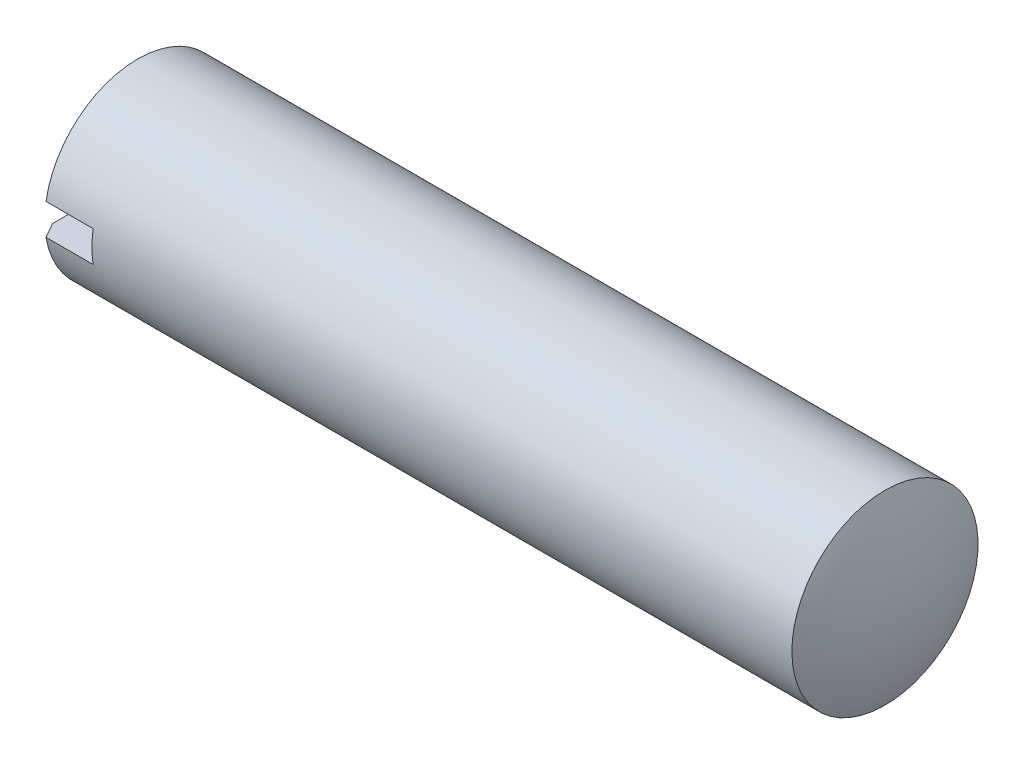
ISO-10303-21;
HEADER;
FILE_DESCRIPTION(('STEP AP214'),'2;1');
FILE_NAME('part.step','',(''),(''),'','','');
FILE_SCHEMA(('AUTOMOTIVE_DESIGN { 1 0 10303 214 1 1 1 1 }'));
ENDSEC;
DATA;
#1=APPLICATION_CONTEXT('core data for automotive mechanical design processes');
#2=APPLICATION_PROTOCOL_DEFINITION('international standard','automotive_design',2000,#1);
#3=PRODUCT_CONTEXT('',#1,'mechanical');
#4=PRODUCT('Part','Part','',(#3));
#5=PRODUCT_RELATED_PRODUCT_CATEGORY('part','',(#4));
#6=PRODUCT_DEFINITION_FORMATION('','',#4);
#7=PRODUCT_DEFINITION_CONTEXT('part definition',#1,'design');
#8=PRODUCT_DEFINITION('design','',#6,#7);
#9=PRODUCT_DEFINITION_SHAPE('','',#8);
#10=(LENGTH_UNIT() NAMED_UNIT(*) SI_UNIT(.MILLI.,.METRE.));
#11=(NAMED_UNIT(*) PLANE_ANGLE_UNIT() SI_UNIT($,.RADIAN.));
#12=(NAMED_UNIT(*) SI_UNIT($,.STERADIAN.) SOLID_ANGLE_UNIT());
#13=UNCERTAINTY_MEASURE_WITH_UNIT(LENGTH_MEASURE(1.E-05),#10,'distance_accuracy_value','');
#14=(GEOMETRIC_REPRESENTATION_CONTEXT(3) GLOBAL_UNCERTAINTY_ASSIGNED_CONTEXT((#13)) GLOBAL_UNIT_ASSIGNED_CONTEXT((#10,
#11,#12)) REPRESENTATION_CONTEXT('',''));
#15=CARTESIAN_POINT('',(0.,0.,0.));
#16=DIRECTION('',(0.,0.,1.));
#17=DIRECTION('',(1.,0.,0.));
#18=AXIS2_PLACEMENT_3D('',#15,#16,#17);
#19=CARTESIAN_POINT('',(0.,0.,0.));
#20=DIRECTION('',(-1.,0.,0.));
#21=DIRECTION('',(0.,0.,1.));
#22=AXIS2_PLACEMENT_3D('',#19,#20,#21);
#23=PLANE('',#22);
#24=CARTESIAN_POINT('',(0.,0.,0.));
#25=DIRECTION('',(-1.,0.,0.));
#26=DIRECTION('',(0.,0.,1.));
#27=AXIS2_PLACEMENT_3D('',#24,#25,#26);
#28=CIRCLE('',#27,5.036);
#29=CARTESIAN_POINT('',(0.,1.,4.93571636138059));
#30=VERTEX_POINT('',#29);
#31=CARTESIAN_POINT('',(0.,1.,-4.93571636138059));
#32=VERTEX_POINT('',#31);
#33=EDGE_CURVE('E107',#30,#32,#28,.T.);
#34=ORIENTED_EDGE('',*,*,#33,.T.);
#35=DIRECTION('',(0.,0.,1.));
#36=VECTOR('',#35,1.);
#37=CARTESIAN_POINT('',(0.,1.,-6.));
#38=LINE('',#37,#36);
#39=EDGE_CURVE('E169',#32,#30,#38,.T.);
#40=ORIENTED_EDGE('',*,*,#39,.T.);
#41=EDGE_LOOP('',(#34,#40));
#42=FACE_BOUND('',#41,.T.);
#43=ADVANCED_FACE('F34',(#42),#23,.T.);
#44=CARTESIAN_POINT('',(0.,-0.999999999999999,-4.93571636138059));
#45=VERTEX_POINT('',#44);
#46=CARTESIAN_POINT('',(0.,-1.,4.93571636138059));
#47=VERTEX_POINT('',#46);
#48=EDGE_CURVE('E103',#45,#47,#28,.T.);
#49=ORIENTED_EDGE('',*,*,#48,.T.);
#50=DIRECTION('',(0.,0.,-1.));
#51=VECTOR('',#50,1.);
#52=CARTESIAN_POINT('',(0.,-0.999999999999999,-6.));
#53=LINE('',#52,#51);
#54=EDGE_CURVE('E95',#47,#45,#53,.T.);
#55=ORIENTED_EDGE('',*,*,#54,.T.);
#56=EDGE_LOOP('',(#49,#55));
#57=FACE_BOUND('',#56,.T.);
#58=ADVANCED_FACE('F161',(#57),#23,.T.);
#59=CARTESIAN_POINT('',(0.,0.,0.));
#60=DIRECTION('',(1.,0.,0.));
#61=DIRECTION('',(0.,0.,-1.));
#62=AXIS2_PLACEMENT_3D('',#59,#60,#61);
#63=CONICAL_SURFACE('',#62,5.036,1.0471975511966);
#64=CARTESIAN_POINT('',(0.5565656594988,0.,0.));
#65=DIRECTION('',(-1.,0.,0.));
#66=DIRECTION('',(0.,0.,1.));
#67=AXIS2_PLACEMENT_3D('',#64,#65,#66);
#68=CIRCLE('',#67,6.);
#69=CARTESIAN_POINT('',(0.5565656594988,0.999999999999999,5.91607978309962));
#70=VERTEX_POINT('',#69);
#71=CARTESIAN_POINT('',(0.5565656594988,1.,-5.91607978309962));
#72=VERTEX_POINT('',#71);
#73=EDGE_CURVE('E100',#70,#72,#68,.T.);
#74=ORIENTED_EDGE('',*,*,#73,.T.);
#75=CARTESIAN_POINT('',(4.73989669271514,1.,-13.2079399731122));
#76=CARTESIAN_POINT('',(4.41853771720275,1.,-12.6497082107171));
#77=CARTESIAN_POINT('',(4.09724308620738,1.,-12.0914392943508));
#78=CARTESIAN_POINT('',(3.45491866839182,1.,-10.9747439104666));
#79=CARTESIAN_POINT('',(3.13388888345056,1.,-10.416317441868));
#80=CARTESIAN_POINT('',(2.49197762047875,1.,-9.29878375972768));
#81=CARTESIAN_POINT('',(2.17109646770066,1.,-8.73967635935326));
#82=CARTESIAN_POINT('',(1.53002759234125,1.,-7.62106803973482));
#83=CARTESIAN_POINT('',(1.2098398657304,1.,-7.0615671228027));
#84=CARTESIAN_POINT('',(0.731752999683985,1.,-6.22374471344359));
#85=CARTESIAN_POINT('',(0.573331144759817,1.,-5.94572157695956));
#86=CARTESIAN_POINT('',(0.25700680573075,1.,-5.38937510078006));
#87=CARTESIAN_POINT('',(0.0991043281520975,1.,-5.11105175737025));
#88=CARTESIAN_POINT('',(-0.215803871687119,1.,-4.5540578090176));
#89=CARTESIAN_POINT('',(-0.372809954009432,1.,-4.27538740768462));
#90=CARTESIAN_POINT('',(-0.685421411461749,1.,-3.71727146951221));
#91=CARTESIAN_POINT('',(-0.841026834596463,1.,-3.43782595967074));
#92=CARTESIAN_POINT('',(-1.07280047051836,1.,-3.01670739395981));
#93=CARTESIAN_POINT('',(-1.15000341162096,1.,-2.87560489491718));
#94=CARTESIAN_POINT('',(-1.30334590311701,1.,-2.59280771309063));
#95=CARTESIAN_POINT('',(-1.37948536629278,1.,-2.45111298296057));
#96=CARTESIAN_POINT('',(-1.53019389021673,1.,-2.16666998976021));
#97=CARTESIAN_POINT('',(-1.60476099220105,1.,-2.02392068095138));
#98=CARTESIAN_POINT('',(-1.71445658720674,1.,-1.80870871103256));
#99=CARTESIAN_POINT('',(-1.75066016319052,1.,-1.73679509885048));
#100=CARTESIAN_POINT('',(-1.82208482318107,1.,-1.59248261773243));
#101=CARTESIAN_POINT('',(-1.85730593731408,1.,-1.52008376376056));
#102=CARTESIAN_POINT('',(-1.92735529771603,1.,-1.37261463948878));
#103=CARTESIAN_POINT('',(-1.96214530553778,1.,-1.29752611216653));
#104=CARTESIAN_POINT('',(-2.02965956084305,1.,-1.1464272735188));
#105=CARTESIAN_POINT('',(-2.06238404828153,1.,-1.07041707049351));
#106=CARTESIAN_POINT('',(-2.12476431844619,1.,-0.917145557122563));
#107=CARTESIAN_POINT('',(-2.15442052211012,1.,-0.83988442007893));
#108=CARTESIAN_POINT('',(-2.20906255805531,1.,-0.683706866904204));
#109=CARTESIAN_POINT('',(-2.23405029456058,1.,-0.604791140337834));
#110=CARTESIAN_POINT('',(-2.2701858104536,1.,-0.470093422562141));
#111=CARTESIAN_POINT('',(-2.28321589301004,1.,-0.414824677608309));
#112=CARTESIAN_POINT('',(-2.3049462303463,1.,-0.303453047162517));
#113=CARTESIAN_POINT('',(-2.31364920633178,1.,-0.247350708818953));
#114=CARTESIAN_POINT('',(-2.32581520982499,1.,-0.134957059900385));
#115=CARTESIAN_POINT('',(-2.32931440889481,1.,-0.0786698056189643));
#116=CARTESIAN_POINT('',(-2.33076867881179,1.,0.0339758725517187));
#117=CARTESIAN_POINT('',(-2.32872385654263,1.,0.0903342950479847));
#118=CARTESIAN_POINT('',(-2.31805799120999,1.,0.217768647722655));
#119=CARTESIAN_POINT('',(-2.30780921847851,1.,0.288706275864185));
#120=CARTESIAN_POINT('',(-2.28041448951625,1.,0.429255862703526));
#121=CARTESIAN_POINT('',(-2.26326048587777,1.,0.498866175055712));
#122=CARTESIAN_POINT('',(-2.2336732423081,1.,0.602653040472886));
#123=CARTESIAN_POINT('',(-2.22308279162358,1.,0.637377371819662));
#124=CARTESIAN_POINT('',(-2.20083833270277,1.,0.706460987269474));
#125=CARTESIAN_POINT('',(-2.18918499575356,1.,0.740820486687518));
#126=CARTESIAN_POINT('',(-2.16499431488939,1.,0.809218732225224));
#127=CARTESIAN_POINT('',(-2.15245710212604,1.,0.843257525085922));
#128=CARTESIAN_POINT('',(-2.12664333011369,1.,0.911058624630585));
#129=CARTESIAN_POINT('',(-2.11336665637935,1.,0.944820887568097));
#130=CARTESIAN_POINT('',(-2.06998388355717,1.,1.05227293315322));
#131=CARTESIAN_POINT('',(-2.03871498859557,1.,1.1254929878084));
#132=CARTESIAN_POINT('',(-1.97418773021611,1.,1.27105481935638));
#133=CARTESIAN_POINT('',(-1.94092900538465,1.,1.34339643380982));
#134=CARTESIAN_POINT('',(-1.87300145739187,1.,1.48745172367306));
#135=CARTESIAN_POINT('',(-1.83833201130301,1.,1.55916510431139));
#136=CARTESIAN_POINT('',(-1.76798292469952,1.,1.7020957142957));
#137=CARTESIAN_POINT('',(-1.73230324722238,1.,1.77331292536865));
#138=CARTESIAN_POINT('',(-1.62404833166124,1.,1.98662313536872));
#139=CARTESIAN_POINT('',(-1.55036430564701,1.,2.12815237228209));
#140=CARTESIAN_POINT('',(-1.40130813476195,1.,2.41025810099267));
#141=CARTESIAN_POINT('',(-1.32593649694034,1.,2.55083486285884));
#142=CARTESIAN_POINT('',(-1.17450983157177,1.,2.83063597104603));
#143=CARTESIAN_POINT('',(-1.0984607133159,1.,2.96986351882429));
#144=CARTESIAN_POINT('',(-0.945628453571545,1.,3.24792809661556));
#145=CARTESIAN_POINT('',(-0.868845256727892,1.,3.38676509614011));
#146=CARTESIAN_POINT('',(-0.637891315016552,1.,3.80258527592079));
#147=CARTESIAN_POINT('',(-0.482967580839101,1.,4.07914988720829));
#148=CARTESIAN_POINT('',(-0.119566497032961,1.,4.72494312842654));
#149=CARTESIAN_POINT('',(0.0893330443967176,0.999999999999999,5.09393352805952));
#150=CARTESIAN_POINT('',(0.50813116989491,0.999999999999999,5.8313517626745));
#151=CARTESIAN_POINT('',(0.718029765114793,0.999999999999999,6.1997795913162));
#152=CARTESIAN_POINT('',(1.13850339248243,0.999999999999999,6.93645171703358));
#153=CARTESIAN_POINT('',(1.34907866934775,0.999999999999999,7.30469587434884));
#154=CARTESIAN_POINT('',(1.77060223251516,0.999999999999999,8.04096877388008));
#155=CARTESIAN_POINT('',(1.98155051744519,0.999999999999999,8.40899751688182));
#156=CARTESIAN_POINT('',(2.40459995529728,0.999999999999999,9.14648067015075));
#157=CARTESIAN_POINT('',(2.61670218630734,0.999999999999999,9.51593446186597));
#158=CARTESIAN_POINT('',(3.04108596616412,0.999999999999999,10.2547396320317));
#159=CARTESIAN_POINT('',(3.25336751523054,0.999999999999999,10.624091010356));
#160=CARTESIAN_POINT('',(3.67796813526823,0.999999999999999,11.3625576054528));
#161=CARTESIAN_POINT('',(3.8902871493782,0.999999999999999,11.7316728549223));
#162=CARTESIAN_POINT('',(4.31502474467981,0.999999999999999,12.4698454062707));
#163=CARTESIAN_POINT('',(4.52744332573743,0.999999999999999,12.8389027082268));
#164=CARTESIAN_POINT('',(4.73989669271514,0.999999999999999,13.2079399731122));
#165=B_SPLINE_CURVE_WITH_KNOTS('',3,(#75,#76,#77,#78,#79,#80,#81,#82,#83,#84,#85,#86,#87,#88,
#89,#90,#91,#92,#93,#94,#95,#96,#97,#98,#99,#100,#101,#102,#103,#104,#105,#106,#107,#108,#109,
#110,#111,#112,#113,#114,#115,#116,#117,#118,#119,#120,#121,#122,#123,#124,#125,#126,#127,#128,
#129,#130,#131,#132,#133,#134,#135,#136,#137,#138,#139,#140,#141,#142,#143,#144,#145,#146,#147,
#148,#149,#150,#151,#152,#153,#154,#155,#156,#157,#158,#159,#160,#161,#162,#163,#164),
.UNSPECIFIED.,.F.,.F.,(4,2,2,2,2,2,2,2,2,2,2,2,2,2,2,2,2,2,2,2,2,2,2,2,2,2,2,2,2,2,2,2,2,2,2,2,
2,2,2,2,2,2,2,2,4),(0.,1.93236881448577,3.86475122216991,5.79868288382603,7.73260327702249,
8.69257649447073,9.65256172875057,10.612129556186,11.5716643702223,12.054187654427,
12.5367502815658,13.019882242275,13.2614145867642,13.5029395167374,13.7511887400155,
13.9994090704805,14.2475953023238,14.4956800792535,14.6658994442621,14.8360116268791,
15.0049357373549,15.1738565911513,15.3884236657494,15.6032415257328,15.7121389898232,
15.8209681475883,15.9297811908741,16.0386111279728,16.2774120534183,16.5162564848264,
16.7552075514775,16.9941673722393,17.4728272005407,17.9513450939743,18.4272722369026,
18.903235555997,19.8542316736438,21.1262890781152,22.3983607146552,23.6709606308449,
24.943555875686,26.2215820771641,27.4996098466158,28.7770795475622,30.0545475337869),.UNSPECIFIED.);
#166=EDGE_CURVE('E128',#72,#32,#165,.T.);
#167=ORIENTED_EDGE('',*,*,#166,.T.);
#168=ORIENTED_EDGE('',*,*,#33,.F.);
#169=EDGE_CURVE('E130',#30,#70,#165,.T.);
#170=ORIENTED_EDGE('',*,*,#169,.T.);
#171=EDGE_LOOP('',(#74,#167,#168,#170));
#172=FACE_BOUND('',#171,.T.);
#173=ADVANCED_FACE('F141',(#172),#63,.T.);
#174=CARTESIAN_POINT('',(0.5565656594988,-0.999999999999999,-5.91607978309962));
#175=VERTEX_POINT('',#174);
#176=CARTESIAN_POINT('',(0.5565656594988,-1.,5.91607978309962));
#177=VERTEX_POINT('',#176);
#178=EDGE_CURVE('E104',#175,#177,#68,.T.);
#179=ORIENTED_EDGE('',*,*,#178,.T.);
#180=CARTESIAN_POINT('',(4.73989669271514,-1.,13.2079399731122));
#181=CARTESIAN_POINT('',(4.41853771720275,-1.,12.649708210717));
#182=CARTESIAN_POINT('',(4.09724308620738,-1.,12.0914392943508));
#183=CARTESIAN_POINT('',(3.45491866839182,-1.,10.9747439104666));
#184=CARTESIAN_POINT('',(3.13388888345056,-1.,10.416317441868));
#185=CARTESIAN_POINT('',(2.49197762047875,-1.,9.29878375972768));
#186=CARTESIAN_POINT('',(2.17109646770066,-1.,8.73967635935326));
#187=CARTESIAN_POINT('',(1.53002759234125,-1.,7.62106803973482));
#188=CARTESIAN_POINT('',(1.2098398657304,-1.,7.0615671228027));
#189=CARTESIAN_POINT('',(0.731752999683986,-1.,6.2237447134436));
#190=CARTESIAN_POINT('',(0.573331144759818,-1.,5.94572157695956));
#191=CARTESIAN_POINT('',(0.257006805730751,-1.,5.38937510078006));
#192=CARTESIAN_POINT('',(0.0991043281520996,-1.,5.11105175737025));
#193=CARTESIAN_POINT('',(-0.215803871687117,-1.,4.55405780901761));
#194=CARTESIAN_POINT('',(-0.372809954009431,-1.,4.27538740768463));
#195=CARTESIAN_POINT('',(-0.685421411461748,-1.,3.71727146951222));
#196=CARTESIAN_POINT('',(-0.841026834596462,-1.,3.43782595967074));
#197=CARTESIAN_POINT('',(-1.07280047051836,-1.,3.01670739395981));
#198=CARTESIAN_POINT('',(-1.15000341162096,-1.,2.87560489491718));
#199=CARTESIAN_POINT('',(-1.30334590311701,-1.,2.59280771309063));
#200=CARTESIAN_POINT('',(-1.37948536629278,-1.,2.45111298296058));
#201=CARTESIAN_POINT('',(-1.53019389021673,-1.,2.16666998976021));
#202=CARTESIAN_POINT('',(-1.60476099220105,-1.,2.02392068095139));
#203=CARTESIAN_POINT('',(-1.71445658720674,-1.,1.80870871103256));
#204=CARTESIAN_POINT('',(-1.75066016319052,-1.,1.73679509885048));
#205=CARTESIAN_POINT('',(-1.82208482318106,-1.,1.59248261773243));
#206=CARTESIAN_POINT('',(-1.85730593731408,-1.,1.52008376376056));
#207=CARTESIAN_POINT('',(-1.92735529771603,-1.,1.37261463948878));
#208=CARTESIAN_POINT('',(-1.96214530553778,-1.,1.29752611216653));
#209=CARTESIAN_POINT('',(-2.02965956084305,-1.,1.1464272735188));
#210=CARTESIAN_POINT('',(-2.06238404828153,-1.,1.07041707049351));
#211=CARTESIAN_POINT('',(-2.12476431844619,-1.,0.917145557122564));
#212=CARTESIAN_POINT('',(-2.15442052211012,-1.,0.839884420078931));
#213=CARTESIAN_POINT('',(-2.2090625580553,-1.,0.683706866904205));
#214=CARTESIAN_POINT('',(-2.23405029456057,-1.,0.604791140337835));
#215=CARTESIAN_POINT('',(-2.2701858104536,-1.,0.470093422562142));
#216=CARTESIAN_POINT('',(-2.28321589301004,-1.,0.41482467760831));
#217=CARTESIAN_POINT('',(-2.3049462303463,-1.,0.303453047162518));
#218=CARTESIAN_POINT('',(-2.31364920633177,-1.,0.247350708818953));
#219=CARTESIAN_POINT('',(-2.32581520982499,-1.,0.134957059900386));
#220=CARTESIAN_POINT('',(-2.32931440889481,-1.,0.0786698056189649));
#221=CARTESIAN_POINT('',(-2.33076867881179,-1.,-0.0339758725517181));
#222=CARTESIAN_POINT('',(-2.32872385654263,-1.,-0.0903342950479841));
#223=CARTESIAN_POINT('',(-2.31805799120999,-1.,-0.217768647722655));
#224=CARTESIAN_POINT('',(-2.30780921847851,-1.,-0.288706275864186));
#225=CARTESIAN_POINT('',(-2.28041448951625,-1.,-0.429255862703526));
#226=CARTESIAN_POINT('',(-2.26326048587777,-1.,-0.498866175055711));
#227=CARTESIAN_POINT('',(-2.2336732423081,-1.,-0.602653040472885));
#228=CARTESIAN_POINT('',(-2.22308279162358,-1.,-0.637377371819661));
#229=CARTESIAN_POINT('',(-2.20083833270277,-1.,-0.706460987269472));
#230=CARTESIAN_POINT('',(-2.18918499575356,-1.,-0.740820486687516));
#231=CARTESIAN_POINT('',(-2.16499431488939,-1.,-0.809218732225223));
#232=CARTESIAN_POINT('',(-2.15245710212604,-1.,-0.843257525085921));
#233=CARTESIAN_POINT('',(-2.12664333011369,-1.,-0.911058624630583));
#234=CARTESIAN_POINT('',(-2.11336665637935,-1.,-0.944820887568096));
#235=CARTESIAN_POINT('',(-2.06998388355717,-1.,-1.05227293315322));
#236=CARTESIAN_POINT('',(-2.03871498859557,-1.,-1.12549298780839));
#237=CARTESIAN_POINT('',(-1.97418773021611,-1.,-1.27105481935638));
#238=CARTESIAN_POINT('',(-1.94092900538466,-1.,-1.34339643380982));
#239=CARTESIAN_POINT('',(-1.87300145739187,-1.,-1.48745172367306));
#240=CARTESIAN_POINT('',(-1.83833201130301,-1.,-1.55916510431139));
#241=CARTESIAN_POINT('',(-1.76798292469952,-1.,-1.7020957142957));
#242=CARTESIAN_POINT('',(-1.73230324722238,-1.,-1.77331292536865));
#243=CARTESIAN_POINT('',(-1.62404833166125,-1.,-1.98662313536872));
#244=CARTESIAN_POINT('',(-1.55036430564701,-1.,-2.12815237228209));
#245=CARTESIAN_POINT('',(-1.40130813476195,-1.,-2.41025810099266));
#246=CARTESIAN_POINT('',(-1.32593649694034,-1.,-2.55083486285883));
#247=CARTESIAN_POINT('',(-1.17450983157177,-1.,-2.83063597104602));
#248=CARTESIAN_POINT('',(-1.09846071331591,-1.,-2.96986351882429));
#249=CARTESIAN_POINT('',(-0.945628453571548,-1.,-3.24792809661556));
#250=CARTESIAN_POINT('',(-0.868845256727895,-1.,-3.3867650961401));
#251=CARTESIAN_POINT('',(-0.637891315016554,-0.999999999999999,-3.80258527592078));
#252=CARTESIAN_POINT('',(-0.482967580839105,-1.,-4.07914988720828));
#253=CARTESIAN_POINT('',(-0.119566497032965,-1.,-4.72494312842653));
#254=CARTESIAN_POINT('',(0.0893330443967138,-0.999999999999999,-5.09393352805951));
#255=CARTESIAN_POINT('',(0.508131169894907,-0.999999999999999,-5.83135176267449));
#256=CARTESIAN_POINT('',(0.718029765114789,-0.999999999999999,-6.1997795913162));
#257=CARTESIAN_POINT('',(1.13850339248243,-0.999999999999999,-6.93645171703358));
#258=CARTESIAN_POINT('',(1.34907866934775,-0.999999999999999,-7.30469587434884));
#259=CARTESIAN_POINT('',(1.77060223251516,-0.999999999999999,-8.04096877388008));
#260=CARTESIAN_POINT('',(1.98155051744519,-0.999999999999999,-8.40899751688181));
#261=CARTESIAN_POINT('',(2.40459995529728,-0.999999999999999,-9.14648067015075));
#262=CARTESIAN_POINT('',(2.61670218630733,-0.999999999999999,-9.51593446186597));
#263=CARTESIAN_POINT('',(3.04108596616412,-0.999999999999999,-10.2547396320317));
#264=CARTESIAN_POINT('',(3.25336751523054,-0.999999999999999,-10.624091010356));
#265=CARTESIAN_POINT('',(3.67796813526823,-0.999999999999999,-11.3625576054528));
#266=CARTESIAN_POINT('',(3.8902871493782,-0.999999999999999,-11.7316728549223));
#267=CARTESIAN_POINT('',(4.31502474467981,-0.999999999999999,-12.4698454062707));
#268=CARTESIAN_POINT('',(4.52744332573743,-0.999999999999999,-12.8389027082268));
#269=CARTESIAN_POINT('',(4.73989669271514,-0.999999999999999,-13.2079399731122));
#270=B_SPLINE_CURVE_WITH_KNOTS('',3,(#180,#181,#182,#183,#184,#185,#186,#187,#188,#189,#190,
#191,#192,#193,#194,#195,#196,#197,#198,#199,#200,#201,#202,#203,#204,#205,#206,#207,#208,#209,
#210,#211,#212,#213,#214,#215,#216,#217,#218,#219,#220,#221,#222,#223,#224,#225,#226,#227,#228,
#229,#230,#231,#232,#233,#234,#235,#236,#237,#238,#239,#240,#241,#242,#243,#244,#245,#246,#247,
#248,#249,#250,#251,#252,#253,#254,#255,#256,#257,#258,#259,#260,#261,#262,#263,#264,#265,#266,
#267,#268,#269),.UNSPECIFIED.,.F.,.F.,(4,2,2,2,2,2,2,2,2,2,2,2,2,2,2,2,2,2,2,2,2,2,2,2,2,2,2,2,
2,2,2,2,2,2,2,2,2,2,2,2,2,2,2,2,4),(0.,1.93236881448577,3.86475122216991,5.79868288382603,
7.73260327702249,8.69257649447072,9.65256172875057,10.612129556186,11.5716643702223,
12.054187654427,12.5367502815658,13.019882242275,13.2614145867642,13.5029395167374,
13.7511887400155,13.9994090704805,14.2475953023238,14.4956800792535,14.6658994442621,
14.8360116268791,15.0049357373549,15.1738565911513,15.3884236657494,15.6032415257328,
15.7121389898232,15.8209681475883,15.9297811908741,16.0386111279728,16.2774120534183,
16.5162564848264,16.7552075514775,16.9941673722393,17.4728272005407,17.9513450939743,
18.4272722369026,18.903235555997,19.8542316736438,21.1262890781152,22.3983607146552,
23.6709606308449,24.943555875686,26.2215820771641,27.4996098466158,28.7770795475622,
30.0545475337869),.UNSPECIFIED.);
#271=EDGE_CURVE('E125',#177,#47,#270,.T.);
#272=ORIENTED_EDGE('',*,*,#271,.T.);
#273=ORIENTED_EDGE('',*,*,#48,.F.);
#274=EDGE_CURVE('E126',#45,#175,#270,.T.);
#275=ORIENTED_EDGE('',*,*,#274,.T.);
#276=EDGE_LOOP('',(#179,#272,#273,#275));
#277=FACE_BOUND('',#276,.T.);
#278=ADVANCED_FACE('F123',(#277),#63,.T.);
#279=CARTESIAN_POINT('',(-12.7,0.,0.));
#280=DIRECTION('',(-1.,0.,0.));
#281=DIRECTION('',(0.,0.,1.));
#282=AXIS2_PLACEMENT_3D('',#279,#280,#281);
#283=CYLINDRICAL_SURFACE('',#282,6.);
#284=CARTESIAN_POINT('',(48.7114574794474,0.,0.));
#285=DIRECTION('',(-1.,0.,0.));
#286=DIRECTION('',(0.,0.,1.));
#287=AXIS2_PLACEMENT_3D('',#284,#285,#286);
#288=CIRCLE('',#287,6.);
#289=CARTESIAN_POINT('',(48.7114574794474,0.,6.));
#290=VERTEX_POINT('',#289);
#291=EDGE_CURVE('E110',#290,#290,#288,.T.);
#292=ORIENTED_EDGE('',*,*,#291,.T.);
#293=EDGE_LOOP('',(#292));
#294=FACE_BOUND('',#293,.T.);
#295=ORIENTED_EDGE('',*,*,#73,.F.);
#296=DIRECTION('',(-1.,0.,0.));
#297=VECTOR('',#296,1.);
#298=CARTESIAN_POINT('',(-12.7,0.999999999999999,5.91607978309962));
#299=LINE('',#298,#297);
#300=CARTESIAN_POINT('',(3.6,0.999999999999999,5.91607978309962));
#301=VERTEX_POINT('',#300);
#302=EDGE_CURVE('E11',#70,#301,#299,.F.);
#303=ORIENTED_EDGE('',*,*,#302,.T.);
#304=CARTESIAN_POINT('',(3.6,0.,0.));
#305=DIRECTION('',(1.,0.,0.));
#306=DIRECTION('',(0.,0.,-1.));
#307=AXIS2_PLACEMENT_3D('',#304,#305,#306);
#308=CIRCLE('',#307,6.);
#309=CARTESIAN_POINT('',(3.6,-1.,5.91607978309962));
#310=VERTEX_POINT('',#309);
#311=EDGE_CURVE('E82',#310,#301,#308,.F.);
#312=ORIENTED_EDGE('',*,*,#311,.F.);
#313=DIRECTION('',(-1.,0.,0.));
#314=VECTOR('',#313,1.);
#315=CARTESIAN_POINT('',(-12.7,-1.,5.91607978309962));
#316=LINE('',#315,#314);
#317=EDGE_CURVE('E41',#310,#177,#316,.T.);
#318=ORIENTED_EDGE('',*,*,#317,.T.);
#319=ORIENTED_EDGE('',*,*,#178,.F.);
#320=DIRECTION('',(-1.,0.,0.));
#321=VECTOR('',#320,1.);
#322=CARTESIAN_POINT('',(-12.7,-0.999999999999999,-5.91607978309962));
#323=LINE('',#322,#321);
#324=CARTESIAN_POINT('',(3.6,-0.999999999999999,-5.91607978309962));
#325=VERTEX_POINT('',#324);
#326=EDGE_CURVE('E115',#175,#325,#323,.F.);
#327=ORIENTED_EDGE('',*,*,#326,.T.);
#328=CARTESIAN_POINT('',(3.6,1.,-5.91607978309962));
#329=VERTEX_POINT('',#328);
#330=EDGE_CURVE('E91',#329,#325,#308,.F.);
#331=ORIENTED_EDGE('',*,*,#330,.F.);
#332=DIRECTION('',(-1.,0.,0.));
#333=VECTOR('',#332,1.);
#334=CARTESIAN_POINT('',(-12.7,1.,-5.91607978309962));
#335=LINE('',#334,#333);
#336=EDGE_CURVE('E89',#329,#72,#335,.T.);
#337=ORIENTED_EDGE('',*,*,#336,.T.);
#338=EDGE_LOOP('',(#295,#303,#312,#318,#319,#327,#331,#337));
#339=FACE_BOUND('',#338,.T.);
#340=ADVANCED_FACE('F98',(#294,#339),#283,.T.);
#341=CARTESIAN_POINT('',(35.3864574794473,0.,0.));
#342=DIRECTION('',(-1.,0.,0.));
#343=DIRECTION('',(0.,1.,0.));
#344=AXIS2_PLACEMENT_3D('',#341,#342,#343);
#345=SPHERICAL_SURFACE('',#344,14.6135425205527);
#346=ORIENTED_EDGE('',*,*,#291,.F.);
#347=EDGE_LOOP('',(#346));
#348=FACE_BOUND('',#347,.T.);
#349=ADVANCED_FACE('F151',(#348),#345,.T.);
#350=CARTESIAN_POINT('',(3.6,1.,-6.));
#351=DIRECTION('',(0.,-1.,0.));
#352=DIRECTION('',(0.,0.,-1.));
#353=AXIS2_PLACEMENT_3D('',#350,#351,#352);
#354=PLANE('',#353);
#355=ORIENTED_EDGE('',*,*,#39,.F.);
#356=ORIENTED_EDGE('',*,*,#166,.F.);
#357=ORIENTED_EDGE('',*,*,#336,.F.);
#358=DIRECTION('',(0.,0.,1.));
#359=VECTOR('',#358,1.);
#360=CARTESIAN_POINT('',(3.6,1.,-6.));
#361=LINE('',#360,#359);
#362=EDGE_CURVE('E48',#329,#301,#361,.T.);
#363=ORIENTED_EDGE('',*,*,#362,.T.);
#364=ORIENTED_EDGE('',*,*,#302,.F.);
#365=ORIENTED_EDGE('',*,*,#169,.F.);
#366=EDGE_LOOP('',(#355,#356,#357,#363,#364,#365));
#367=FACE_BOUND('',#366,.T.);
#368=ADVANCED_FACE('F92',(#367),#354,.T.);
#369=CARTESIAN_POINT('',(3.6,-0.999999999999999,-6.));
#370=DIRECTION('',(0.,1.,0.));
#371=DIRECTION('',(0.,0.,1.));
#372=AXIS2_PLACEMENT_3D('',#369,#370,#371);
#373=PLANE('',#372);
#374=ORIENTED_EDGE('',*,*,#54,.F.);
#375=ORIENTED_EDGE('',*,*,#271,.F.);
#376=ORIENTED_EDGE('',*,*,#317,.F.);
#377=DIRECTION('',(0.,0.,-1.));
#378=VECTOR('',#377,1.);
#379=CARTESIAN_POINT('',(3.6,-0.999999999999999,-6.));
#380=LINE('',#379,#378);
#381=EDGE_CURVE('E85',#310,#325,#380,.T.);
#382=ORIENTED_EDGE('',*,*,#381,.T.);
#383=ORIENTED_EDGE('',*,*,#326,.F.);
#384=ORIENTED_EDGE('',*,*,#274,.F.);
#385=EDGE_LOOP('',(#374,#375,#376,#382,#383,#384));
#386=FACE_BOUND('',#385,.T.);
#387=ADVANCED_FACE('F144',(#386),#373,.T.);
#388=CARTESIAN_POINT('',(3.6,1.,-6.));
#389=DIRECTION('',(1.,0.,0.));
#390=DIRECTION('',(0.,0.,-1.));
#391=AXIS2_PLACEMENT_3D('',#388,#389,#390);
#392=PLANE('',#391);
#393=ORIENTED_EDGE('',*,*,#381,.F.);
#394=ORIENTED_EDGE('',*,*,#311,.T.);
#395=ORIENTED_EDGE('',*,*,#362,.F.);
#396=ORIENTED_EDGE('',*,*,#330,.T.);
#397=EDGE_LOOP('',(#393,#394,#395,#396));
#398=FACE_BOUND('',#397,.T.);
#399=ADVANCED_FACE('F83',(#398),#392,.F.);
#400=CLOSED_SHELL('',(#43,#58,#173,#278,#340,#349,#368,#387,#399));
#401=MANIFOLD_SOLID_BREP('B2',#400);
#402=ADVANCED_BREP_SHAPE_REPRESENTATION('',(#18,#401),#14);
#403=SHAPE_DEFINITION_REPRESENTATION(#9,#402);
ENDSEC;
END-ISO-10303-21;
